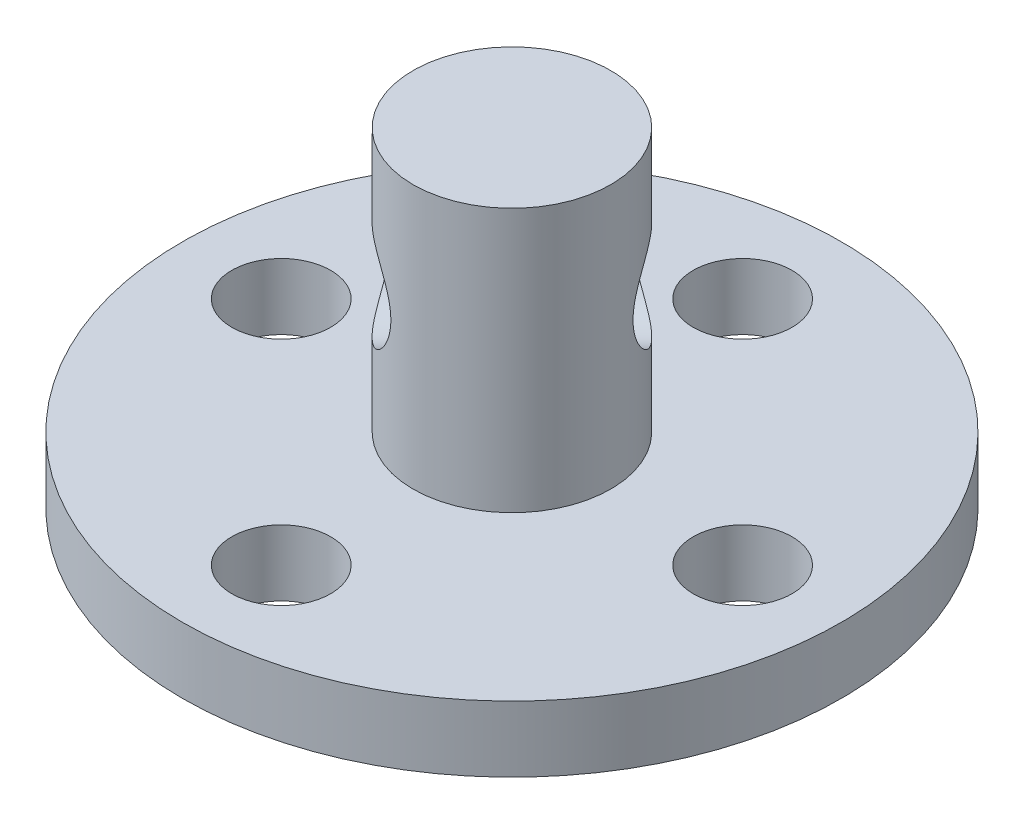
ISO-10303-21;
HEADER;
FILE_DESCRIPTION(('STEP AP214'),'2;1');
FILE_NAME('part.step','',(''),(''),'','','');
FILE_SCHEMA(('AUTOMOTIVE_DESIGN { 1 0 10303 214 1 1 1 1 }'));
ENDSEC;
DATA;
#1=APPLICATION_CONTEXT('core data for automotive mechanical design processes');
#2=APPLICATION_PROTOCOL_DEFINITION('international standard','automotive_design',2000,#1);
#3=PRODUCT_CONTEXT('',#1,'mechanical');
#4=PRODUCT('Part','Part','',(#3));
#5=PRODUCT_RELATED_PRODUCT_CATEGORY('part','',(#4));
#6=PRODUCT_DEFINITION_FORMATION('','',#4);
#7=PRODUCT_DEFINITION_CONTEXT('part definition',#1,'design');
#8=PRODUCT_DEFINITION('design','',#6,#7);
#9=PRODUCT_DEFINITION_SHAPE('','',#8);
#10=(LENGTH_UNIT() NAMED_UNIT(*) SI_UNIT(.MILLI.,.METRE.));
#11=(NAMED_UNIT(*) PLANE_ANGLE_UNIT() SI_UNIT($,.RADIAN.));
#12=(NAMED_UNIT(*) SI_UNIT($,.STERADIAN.) SOLID_ANGLE_UNIT());
#13=UNCERTAINTY_MEASURE_WITH_UNIT(LENGTH_MEASURE(1.E-05),#10,'distance_accuracy_value','');
#14=(GEOMETRIC_REPRESENTATION_CONTEXT(3) GLOBAL_UNCERTAINTY_ASSIGNED_CONTEXT((#13)) GLOBAL_UNIT_ASSIGNED_CONTEXT((#10,
#11,#12)) REPRESENTATION_CONTEXT('',''));
#15=CARTESIAN_POINT('',(0.,0.,0.));
#16=DIRECTION('',(0.,0.,1.));
#17=DIRECTION('',(1.,0.,0.));
#18=AXIS2_PLACEMENT_3D('',#15,#16,#17);
#19=CARTESIAN_POINT('',(0.,2.,0.));
#20=DIRECTION('',(0.,1.,0.));
#21=DIRECTION('',(0.,0.,1.));
#22=AXIS2_PLACEMENT_3D('',#19,#20,#21);
#23=PLANE('',#22);
#24=CARTESIAN_POINT('',(3.95332173747447E-13,2.,7.));
#25=DIRECTION('',(0.,1.,0.));
#26=DIRECTION('',(0.,0.,1.));
#27=AXIS2_PLACEMENT_3D('',#24,#25,#26);
#28=CIRCLE('',#27,1.50000000000042);
#29=CARTESIAN_POINT('',(3.95332173747447E-13,2.,8.50000000000043));
#30=VERTEX_POINT('',#29);
#31=EDGE_CURVE('E120',#30,#30,#28,.T.);
#32=ORIENTED_EDGE('',*,*,#31,.F.);
#33=EDGE_LOOP('',(#32));
#34=FACE_BOUND('',#33,.T.);
#35=CARTESIAN_POINT('',(0.,2.,-7.));
#36=DIRECTION('',(0.,1.,0.));
#37=DIRECTION('',(0.,0.,1.));
#38=AXIS2_PLACEMENT_3D('',#35,#36,#37);
#39=CIRCLE('',#38,1.5);
#40=CARTESIAN_POINT('',(0.,2.,-5.5));
#41=VERTEX_POINT('',#40);
#42=EDGE_CURVE('E132',#41,#41,#39,.T.);
#43=ORIENTED_EDGE('',*,*,#42,.F.);
#44=EDGE_LOOP('',(#43));
#45=FACE_BOUND('',#44,.T.);
#46=CARTESIAN_POINT('',(0.,2.,0.));
#47=DIRECTION('',(0.,1.,0.));
#48=DIRECTION('',(0.,0.,1.));
#49=AXIS2_PLACEMENT_3D('',#46,#47,#48);
#50=CIRCLE('',#49,10.);
#51=CARTESIAN_POINT('',(0.,2.,10.));
#52=VERTEX_POINT('',#51);
#53=EDGE_CURVE('E10',#52,#52,#50,.T.);
#54=ORIENTED_EDGE('',*,*,#53,.T.);
#55=EDGE_LOOP('',(#54));
#56=FACE_BOUND('',#55,.T.);
#57=CARTESIAN_POINT('',(0.,2.,0.));
#58=DIRECTION('',(0.,1.,0.));
#59=DIRECTION('',(0.,0.,1.));
#60=AXIS2_PLACEMENT_3D('',#57,#58,#59);
#61=CIRCLE('',#60,3.);
#62=CARTESIAN_POINT('',(0.,2.,3.));
#63=VERTEX_POINT('',#62);
#64=EDGE_CURVE('E53',#63,#63,#61,.T.);
#65=ORIENTED_EDGE('',*,*,#64,.F.);
#66=EDGE_LOOP('',(#65));
#67=FACE_BOUND('',#66,.T.);
#68=CARTESIAN_POINT('',(7.0000000000002,2.,-1.97666086873723E-13));
#69=DIRECTION('',(0.,1.,0.));
#70=DIRECTION('',(0.,0.,1.));
#71=AXIS2_PLACEMENT_3D('',#68,#69,#70);
#72=CIRCLE('',#71,1.50000000000015);
#73=CARTESIAN_POINT('',(7.0000000000002,2.,1.49999999999996));
#74=VERTEX_POINT('',#73);
#75=EDGE_CURVE('E126',#74,#74,#72,.T.);
#76=ORIENTED_EDGE('',*,*,#75,.F.);
#77=EDGE_LOOP('',(#76));
#78=FACE_BOUND('',#77,.T.);
#79=CARTESIAN_POINT('',(-6.9999999999998,2.,1.98523339633126E-13));
#80=DIRECTION('',(0.,1.,0.));
#81=DIRECTION('',(0.,0.,1.));
#82=AXIS2_PLACEMENT_3D('',#79,#80,#81);
#83=CIRCLE('',#82,1.50000000000032);
#84=CARTESIAN_POINT('',(-6.9999999999998,2.,1.50000000000052));
#85=VERTEX_POINT('',#84);
#86=EDGE_CURVE('E109',#85,#85,#83,.T.);
#87=ORIENTED_EDGE('',*,*,#86,.F.);
#88=EDGE_LOOP('',(#87));
#89=FACE_BOUND('',#88,.T.);
#90=ADVANCED_FACE('F35',(#34,#45,#56,#67,#78,#89),#23,.T.);
#91=CARTESIAN_POINT('',(0.,0.,0.));
#92=DIRECTION('',(0.,1.,0.));
#93=DIRECTION('',(0.,0.,1.));
#94=AXIS2_PLACEMENT_3D('',#91,#92,#93);
#95=PLANE('',#94);
#96=CARTESIAN_POINT('',(0.,0.,0.));
#97=DIRECTION('',(0.,1.,0.));
#98=DIRECTION('',(0.,0.,1.));
#99=AXIS2_PLACEMENT_3D('',#96,#97,#98);
#100=CIRCLE('',#99,10.);
#101=CARTESIAN_POINT('',(0.,0.,10.));
#102=VERTEX_POINT('',#101);
#103=EDGE_CURVE('E48',#102,#102,#100,.T.);
#104=ORIENTED_EDGE('',*,*,#103,.F.);
#105=EDGE_LOOP('',(#104));
#106=FACE_BOUND('',#105,.T.);
#107=CARTESIAN_POINT('',(0.,0.,-7.));
#108=DIRECTION('',(0.,1.,0.));
#109=DIRECTION('',(0.,0.,1.));
#110=AXIS2_PLACEMENT_3D('',#107,#108,#109);
#111=CIRCLE('',#110,1.5);
#112=CARTESIAN_POINT('',(0.,0.,-5.5));
#113=VERTEX_POINT('',#112);
#114=EDGE_CURVE('E129',#113,#113,#111,.T.);
#115=ORIENTED_EDGE('',*,*,#114,.T.);
#116=EDGE_LOOP('',(#115));
#117=FACE_BOUND('',#116,.T.);
#118=CARTESIAN_POINT('',(7.0000000000002,0.,-1.97666086873723E-13));
#119=DIRECTION('',(0.,1.,0.));
#120=DIRECTION('',(0.,0.,1.));
#121=AXIS2_PLACEMENT_3D('',#118,#119,#120);
#122=CIRCLE('',#121,1.50000000000015);
#123=CARTESIAN_POINT('',(7.0000000000002,0.,1.49999999999996));
#124=VERTEX_POINT('',#123);
#125=EDGE_CURVE('E123',#124,#124,#122,.T.);
#126=ORIENTED_EDGE('',*,*,#125,.T.);
#127=EDGE_LOOP('',(#126));
#128=FACE_BOUND('',#127,.T.);
#129=CARTESIAN_POINT('',(3.95332173747447E-13,0.,7.));
#130=DIRECTION('',(0.,1.,0.));
#131=DIRECTION('',(0.,0.,1.));
#132=AXIS2_PLACEMENT_3D('',#129,#130,#131);
#133=CIRCLE('',#132,1.50000000000042);
#134=CARTESIAN_POINT('',(3.95332173747447E-13,0.,8.50000000000043));
#135=VERTEX_POINT('',#134);
#136=EDGE_CURVE('E116',#135,#135,#133,.T.);
#137=ORIENTED_EDGE('',*,*,#136,.T.);
#138=EDGE_LOOP('',(#137));
#139=FACE_BOUND('',#138,.T.);
#140=CARTESIAN_POINT('',(-6.9999999999998,0.,1.98523339633126E-13));
#141=DIRECTION('',(0.,1.,0.));
#142=DIRECTION('',(0.,0.,1.));
#143=AXIS2_PLACEMENT_3D('',#140,#141,#142);
#144=CIRCLE('',#143,1.50000000000032);
#145=CARTESIAN_POINT('',(-6.9999999999998,0.,1.50000000000052));
#146=VERTEX_POINT('',#145);
#147=EDGE_CURVE('E112',#146,#146,#144,.T.);
#148=ORIENTED_EDGE('',*,*,#147,.T.);
#149=EDGE_LOOP('',(#148));
#150=FACE_BOUND('',#149,.T.);
#151=ADVANCED_FACE('F81',(#106,#117,#128,#139,#150),#95,.F.);
#152=CARTESIAN_POINT('',(0.,2.,0.));
#153=DIRECTION('',(0.,-1.,0.));
#154=DIRECTION('',(0.,0.,-1.));
#155=AXIS2_PLACEMENT_3D('',#152,#153,#154);
#156=CYLINDRICAL_SURFACE('',#155,10.);
#157=ORIENTED_EDGE('',*,*,#53,.F.);
#158=EDGE_LOOP('',(#157));
#159=FACE_BOUND('',#158,.T.);
#160=ORIENTED_EDGE('',*,*,#103,.T.);
#161=EDGE_LOOP('',(#160));
#162=FACE_BOUND('',#161,.T.);
#163=ADVANCED_FACE('F37',(#159,#162),#156,.T.);
#164=CARTESIAN_POINT('',(0.,2.,-7.));
#165=DIRECTION('',(0.,-1.,0.));
#166=DIRECTION('',(0.,0.,-1.));
#167=AXIS2_PLACEMENT_3D('',#164,#165,#166);
#168=CYLINDRICAL_SURFACE('',#167,1.5);
#169=ORIENTED_EDGE('',*,*,#42,.T.);
#170=EDGE_LOOP('',(#169));
#171=FACE_BOUND('',#170,.T.);
#172=ORIENTED_EDGE('',*,*,#114,.F.);
#173=EDGE_LOOP('',(#172));
#174=FACE_BOUND('',#173,.T.);
#175=ADVANCED_FACE('F91',(#171,#174),#168,.F.);
#176=CARTESIAN_POINT('',(7.0000000000002,2.,-1.97666086873723E-13));
#177=DIRECTION('',(0.,-1.,0.));
#178=DIRECTION('',(0.,0.,-1.));
#179=AXIS2_PLACEMENT_3D('',#176,#177,#178);
#180=CYLINDRICAL_SURFACE('',#179,1.50000000000015);
#181=ORIENTED_EDGE('',*,*,#75,.T.);
#182=EDGE_LOOP('',(#181));
#183=FACE_BOUND('',#182,.T.);
#184=ORIENTED_EDGE('',*,*,#125,.F.);
#185=EDGE_LOOP('',(#184));
#186=FACE_BOUND('',#185,.T.);
#187=ADVANCED_FACE('F94',(#183,#186),#180,.F.);
#188=CARTESIAN_POINT('',(3.95332173747447E-13,2.,7.));
#189=DIRECTION('',(0.,-1.,0.));
#190=DIRECTION('',(0.,0.,-1.));
#191=AXIS2_PLACEMENT_3D('',#188,#189,#190);
#192=CYLINDRICAL_SURFACE('',#191,1.50000000000042);
#193=ORIENTED_EDGE('',*,*,#31,.T.);
#194=EDGE_LOOP('',(#193));
#195=FACE_BOUND('',#194,.T.);
#196=ORIENTED_EDGE('',*,*,#136,.F.);
#197=EDGE_LOOP('',(#196));
#198=FACE_BOUND('',#197,.T.);
#199=ADVANCED_FACE('F98',(#195,#198),#192,.F.);
#200=CARTESIAN_POINT('',(-6.9999999999998,2.,1.98523339633126E-13));
#201=DIRECTION('',(0.,-1.,0.));
#202=DIRECTION('',(0.,0.,-1.));
#203=AXIS2_PLACEMENT_3D('',#200,#201,#202);
#204=CYLINDRICAL_SURFACE('',#203,1.50000000000032);
#205=ORIENTED_EDGE('',*,*,#86,.T.);
#206=EDGE_LOOP('',(#205));
#207=FACE_BOUND('',#206,.T.);
#208=ORIENTED_EDGE('',*,*,#147,.F.);
#209=EDGE_LOOP('',(#208));
#210=FACE_BOUND('',#209,.T.);
#211=ADVANCED_FACE('F77',(#207,#210),#204,.F.);
#212=CARTESIAN_POINT('',(0.,10.,0.));
#213=DIRECTION('',(0.,-1.,0.));
#214=DIRECTION('',(0.,0.,-1.));
#215=AXIS2_PLACEMENT_3D('',#212,#213,#214);
#216=CYLINDRICAL_SURFACE('',#215,3.);
#217=CARTESIAN_POINT('',(-2.8977774788672,6.,0.776457135307578));
#218=CARTESIAN_POINT('',(-2.89777843642086,6.07816171229288,0.77646580794522));
#219=CARTESIAN_POINT('',(-2.89596075365292,6.15642211728757,0.783337885586112));
#220=CARTESIAN_POINT('',(-2.88854556363684,6.31054089701573,0.810238787422568));
#221=CARTESIAN_POINT('',(-2.88294011324793,6.38639387256511,0.830295257550616));
#222=CARTESIAN_POINT('',(-2.86759385571555,6.53317749651591,0.881825990933521));
#223=CARTESIAN_POINT('',(-2.85787499736416,6.60413197871038,0.913239525995637));
#224=CARTESIAN_POINT('',(-2.83375960105533,6.74013630299508,0.985522074791584));
#225=CARTESIAN_POINT('',(-2.81936281002991,6.80518582539369,1.02639160004349));
#226=CARTESIAN_POINT('',(-2.78384605508351,6.93345859283626,1.11931695974481));
#227=CARTESIAN_POINT('',(-2.76226951340349,6.99608870351032,1.17201739854083));
#228=CARTESIAN_POINT('',(-2.7120800954357,7.11211258261006,1.28389309696415));
#229=CARTESIAN_POINT('',(-2.68346372649267,7.16550174387528,1.34307156240822));
#230=CARTESIAN_POINT('',(-2.61633504151044,7.26505072672149,1.46978353515752));
#231=CARTESIAN_POINT('',(-2.57728569203883,7.3104806517893,1.53761134146164));
#232=CARTESIAN_POINT('',(-2.49007432475969,7.38771127986864,1.6751542091128));
#233=CARTESIAN_POINT('',(-2.44191808567331,7.41952058420576,1.74486804977897));
#234=CARTESIAN_POINT('',(-2.34071742954987,7.46625699195165,1.87817425418939));
#235=CARTESIAN_POINT('',(-2.28826464060797,7.4822242895333,1.94184923030435));
#236=CARTESIAN_POINT('',(-2.17716035445959,7.50024917801256,2.06564121032914));
#237=CARTESIAN_POINT('',(-2.11851262971612,7.50231518519356,2.12576034519839));
#238=CARTESIAN_POINT('',(-2.0023114029252,7.49287998904448,2.23530137136983));
#239=CARTESIAN_POINT('',(-1.94510625043171,7.48254297671817,2.28519887174934));
#240=CARTESIAN_POINT('',(-1.82903282067119,7.45067873414301,2.37912040040673));
#241=CARTESIAN_POINT('',(-1.7701644192651,7.42915066653566,2.42314398886577));
#242=CARTESIAN_POINT('',(-1.65187898356766,7.37537615086528,2.50530608030928));
#243=CARTESIAN_POINT('',(-1.59246562724666,7.3429855302419,2.54335473361968));
#244=CARTESIAN_POINT('',(-1.47580220064364,7.26860487569776,2.61278069336991));
#245=CARTESIAN_POINT('',(-1.4185529134213,7.22661140504648,2.6441556035889));
#246=CARTESIAN_POINT('',(-1.30277736945862,7.12965697270048,2.70321718660423));
#247=CARTESIAN_POINT('',(-1.24464195101828,7.07384545751099,2.73027487166611));
#248=CARTESIAN_POINT('',(-1.13537205134785,6.95311541260474,2.77749540009897));
#249=CARTESIAN_POINT('',(-1.08424296543307,6.88818994158891,2.79765294762602));
#250=CARTESIAN_POINT('',(-0.988467637856764,6.74602771136387,2.83296699306694));
#251=CARTESIAN_POINT('',(-0.944439272066004,6.66827096541868,2.84772461492292));
#252=CARTESIAN_POINT('',(-0.870203141463087,6.5055934929615,2.87128516634126));
#253=CARTESIAN_POINT('',(-0.839980958308236,6.42068035047366,2.8800943127519));
#254=CARTESIAN_POINT('',(-0.797898740855268,6.25317823307581,2.89202420526221));
#255=CARTESIAN_POINT('',(-0.784773377993293,6.17093832143467,2.89554041189933));
#256=CARTESIAN_POINT('',(-0.773923684249208,6.00539798772519,2.89846195751578));
#257=CARTESIAN_POINT('',(-0.776188474338449,5.92209835632032,2.89787020033615));
#258=CARTESIAN_POINT('',(-0.79476043293402,5.76651912213191,2.89282271219333));
#259=CARTESIAN_POINT('',(-0.809504390277562,5.69403082333811,2.88879674637905));
#260=CARTESIAN_POINT('',(-0.849847525365734,5.55244832059356,2.87718549622092));
#261=CARTESIAN_POINT('',(-0.875450218468093,5.48335522388009,2.86959905914147));
#262=CARTESIAN_POINT('',(-0.937320913584755,5.34688300364596,2.85000428601381));
#263=CARTESIAN_POINT('',(-0.974027961374789,5.27973147471967,2.83780742241692));
#264=CARTESIAN_POINT('',(-1.05564763070852,5.15179609269151,2.80846718922544));
#265=CARTESIAN_POINT('',(-1.10056446582023,5.09101553473008,2.79132127696575));
#266=CARTESIAN_POINT('',(-1.2028340494715,4.96953184871468,2.74893115939282));
#267=CARTESIAN_POINT('',(-1.26104068458324,4.90980427392351,2.72293857041295));
#268=CARTESIAN_POINT('',(-1.38303494861756,4.80088164300961,2.66304918010131));
#269=CARTESIAN_POINT('',(-1.44682445252409,4.75169014465419,2.62914971686415));
#270=CARTESIAN_POINT('',(-1.57919386501896,4.66413941107485,2.55189425785637));
#271=CARTESIAN_POINT('',(-1.64785576996499,4.62610032268364,2.50831229866666));
#272=CARTESIAN_POINT('',(-1.78542113058999,4.56429314421391,2.41231873467999));
#273=CARTESIAN_POINT('',(-1.85432432047733,4.54051252295054,2.35991493507782));
#274=CARTESIAN_POINT('',(-1.98311144359731,4.50994715373801,2.25247602694358));
#275=CARTESIAN_POINT('',(-2.04324285223114,4.50180318618583,2.1981235133838));
#276=CARTESIAN_POINT('',(-2.15902393796181,4.4987351018184,2.08451046937595));
#277=CARTESIAN_POINT('',(-2.21467517691623,4.50380635721465,2.02525166408008));
#278=CARTESIAN_POINT('',(-2.31635207595352,4.52612461019344,1.90791731594305));
#279=CARTESIAN_POINT('',(-2.36277036625901,4.54254727388651,1.85002110919704));
#280=CARTESIAN_POINT('',(-2.44945348099616,4.58599049895446,1.73362251777722));
#281=CARTESIAN_POINT('',(-2.48971742182761,4.61301258014018,1.67512004734523));
#282=CARTESIAN_POINT('',(-2.56540042262159,4.67809057824896,1.55687507914991));
#283=CARTESIAN_POINT('',(-2.60053861020871,4.71656898481176,1.49718656380227));
#284=CARTESIAN_POINT('',(-2.66401345602036,4.80293689628858,1.3810927050713));
#285=CARTESIAN_POINT('',(-2.69234697700718,4.85083072367351,1.32468888511397));
#286=CARTESIAN_POINT('',(-2.74520076947934,4.96019570853405,1.21166858581719));
#287=CARTESIAN_POINT('',(-2.76906092274573,5.02254373121579,1.15558958126823));
#288=CARTESIAN_POINT('',(-2.8100006811322,5.15617608169466,1.05214039162088));
#289=CARTESIAN_POINT('',(-2.82707429614389,5.22746823130153,1.00477791984153));
#290=CARTESIAN_POINT('',(-2.85575022521722,5.37995496987143,0.920191613571842));
#291=CARTESIAN_POINT('',(-2.86716258468163,5.4613912966931,0.88333547926554));
#292=CARTESIAN_POINT('',(-2.8845080528995,5.62999860650967,0.824963295294638));
#293=CARTESIAN_POINT('',(-2.89045950183027,5.71714933336903,0.803395954954636));
#294=CARTESIAN_POINT('',(-2.89524136224008,5.83770803347799,0.785870399492784));
#295=CARTESIAN_POINT('',(-2.89619347565166,5.87005184159682,0.782348442320786));
#296=CARTESIAN_POINT('',(-2.89746135588973,5.93492472102336,0.777639926487422));
#297=CARTESIAN_POINT('',(-2.89777708014604,5.96745380457881,0.776453524059165));
#298=CARTESIAN_POINT('',(-2.8977774788672,6.,0.776457135307578));
#299=B_SPLINE_CURVE_WITH_KNOTS('',3,(#217,#218,#219,#220,#221,#222,#223,#224,#225,#226,#227,
#228,#229,#230,#231,#232,#233,#234,#235,#236,#237,#238,#239,#240,#241,#242,#243,#244,#245,#246,
#247,#248,#249,#250,#251,#252,#253,#254,#255,#256,#257,#258,#259,#260,#261,#262,#263,#264,#265,
#266,#267,#268,#269,#270,#271,#272,#273,#274,#275,#276,#277,#278,#279,#280,#281,#282,#283,#284,
#285,#286,#287,#288,#289,#290,#291,#292,#293,#294,#295,#296,#297,#298),.UNSPECIFIED.,.T.,.F.,(4,
2,2,2,2,2,2,2,2,2,2,2,2,2,2,2,2,2,2,2,2,2,2,2,2,2,2,2,2,2,2,2,2,2,2,2,2,2,2,2,4),(0.,
0.234348183892073,0.469189339237207,0.702792893878328,0.936409088167724,1.18929346874735,
1.44230356626556,1.71236838358145,1.98226240445837,2.23295227451903,2.4834903552906,
2.71224146226807,2.94100968776183,3.1729430209672,3.40495949025408,3.65890787185336,
3.91305072368878,4.18333262594172,4.45333161317557,4.70193436281318,4.95036139782559,
5.17161275136038,5.39293578654094,5.62450944609131,5.85620229330071,6.1171011537092,
6.37808797467303,6.64596272119449,6.91360169713157,7.1566840558423,7.39968130190957,
7.62666637307239,7.85368400268019,8.09041126079208,8.32724745151078,8.58765362775101,
8.84828914267731,9.11716123557907,9.3851269950414,9.48270202777964,9.5802835874181),.UNSPECIFIED.);
#300=CARTESIAN_POINT('',(-2.8977774788672,6.,0.776457135307578));
#301=VERTEX_POINT('',#300);
#302=EDGE_CURVE('E39',#301,#301,#299,.T.);
#303=ORIENTED_EDGE('',*,*,#302,.T.);
#304=EDGE_LOOP('',(#303));
#305=FACE_BOUND('',#304,.T.);
#306=CARTESIAN_POINT('',(0.776457135307547,6.,-2.89777747886721));
#307=CARTESIAN_POINT('',(0.776465807945189,5.92183828770712,-2.89777843642087));
#308=CARTESIAN_POINT('',(0.783337885586081,5.84357788271243,-2.89596075365293));
#309=CARTESIAN_POINT('',(0.810238787422538,5.68945910298427,-2.88854556363685));
#310=CARTESIAN_POINT('',(0.830295257550587,5.61360612743489,-2.88294011324794));
#311=CARTESIAN_POINT('',(0.881825990933491,5.46682250348409,-2.86759385571556));
#312=CARTESIAN_POINT('',(0.913239525995606,5.39586802128962,-2.85787499736417));
#313=CARTESIAN_POINT('',(0.985522074791554,5.25986369700492,-2.83375960105534));
#314=CARTESIAN_POINT('',(1.02639160004346,5.19481417460631,-2.81936281002992));
#315=CARTESIAN_POINT('',(1.11931695974478,5.06654140716374,-2.78384605508352));
#316=CARTESIAN_POINT('',(1.1720173985408,5.00391129648969,-2.76226951340351));
#317=CARTESIAN_POINT('',(1.28389309696413,4.88788741738994,-2.71208009543571));
#318=CARTESIAN_POINT('',(1.34307156240819,4.83449825612472,-2.68346372649268));
#319=CARTESIAN_POINT('',(1.46978353515749,4.73494927327851,-2.61633504151046));
#320=CARTESIAN_POINT('',(1.53761134146162,4.6895193482107,-2.57728569203884));
#321=CARTESIAN_POINT('',(1.67515420911277,4.61228872013136,-2.49007432475971));
#322=CARTESIAN_POINT('',(1.74486804977894,4.58047941579424,-2.44191808567333));
#323=CARTESIAN_POINT('',(1.87817425418937,4.53374300804835,-2.34071742954989));
#324=CARTESIAN_POINT('',(1.94184923030433,4.5177757104667,-2.28826464060799));
#325=CARTESIAN_POINT('',(2.06564121032912,4.49975082198744,-2.17716035445961));
#326=CARTESIAN_POINT('',(2.12576034519836,4.49768481480644,-2.11851262971614));
#327=CARTESIAN_POINT('',(2.23530137136981,4.50712001095553,-2.00231140292522));
#328=CARTESIAN_POINT('',(2.28519887174932,4.51745702328184,-1.94510625043173));
#329=CARTESIAN_POINT('',(2.37912040040671,4.54932126585699,-1.82903282067121));
#330=CARTESIAN_POINT('',(2.42314398886575,4.57084933346434,-1.77016441926513));
#331=CARTESIAN_POINT('',(2.50530608030926,4.62462384913472,-1.65187898356769));
#332=CARTESIAN_POINT('',(2.54335473361967,4.6570144697581,-1.59246562724668));
#333=CARTESIAN_POINT('',(2.6127806933699,4.73139512430224,-1.47580220064367));
#334=CARTESIAN_POINT('',(2.64415560358889,4.77338859495353,-1.41855291342133));
#335=CARTESIAN_POINT('',(2.70321718660421,4.87034302729952,-1.30277736945865));
#336=CARTESIAN_POINT('',(2.7302748716661,4.92615454248902,-1.24464195101831));
#337=CARTESIAN_POINT('',(2.77749540009896,5.04688458739527,-1.13537205134787));
#338=CARTESIAN_POINT('',(2.79765294762601,5.11181005841109,-1.0842429654331));
#339=CARTESIAN_POINT('',(2.83296699306693,5.25397228863613,-0.988467637856793));
#340=CARTESIAN_POINT('',(2.84772461492291,5.33172903458132,-0.944439272066034));
#341=CARTESIAN_POINT('',(2.87128516634125,5.4944065070385,-0.870203141463117));
#342=CARTESIAN_POINT('',(2.88009431275189,5.57931964952634,-0.839980958308266));
#343=CARTESIAN_POINT('',(2.8920242052622,5.74682176692419,-0.797898740855298));
#344=CARTESIAN_POINT('',(2.89554041189933,5.82906167856533,-0.784773377993323));
#345=CARTESIAN_POINT('',(2.89846195751577,5.99460201227481,-0.773923684249239));
#346=CARTESIAN_POINT('',(2.89787020033614,6.07790164367968,-0.776188474338479));
#347=CARTESIAN_POINT('',(2.89282271219332,6.23348087786809,-0.79476043293405));
#348=CARTESIAN_POINT('',(2.88879674637904,6.30596917666189,-0.809504390277593));
#349=CARTESIAN_POINT('',(2.87718549622091,6.44755167940644,-0.849847525365765));
#350=CARTESIAN_POINT('',(2.86959905914146,6.51664477611991,-0.875450218468124));
#351=CARTESIAN_POINT('',(2.8500042860138,6.65311699635405,-0.937320913584786));
#352=CARTESIAN_POINT('',(2.83780742241691,6.72026852528033,-0.97402796137482));
#353=CARTESIAN_POINT('',(2.80846718922543,6.84820390730849,-1.05564763070855));
#354=CARTESIAN_POINT('',(2.79132127696574,6.90898446526993,-1.10056446582026));
#355=CARTESIAN_POINT('',(2.74893115939281,7.03046815128532,-1.20283404947153));
#356=CARTESIAN_POINT('',(2.72293857041293,7.09019572607649,-1.26104068458327));
#357=CARTESIAN_POINT('',(2.6630491801013,7.19911835699039,-1.38303494861759));
#358=CARTESIAN_POINT('',(2.62914971686414,7.24830985534581,-1.44682445252412));
#359=CARTESIAN_POINT('',(2.55189425785635,7.33586058892515,-1.57919386501899));
#360=CARTESIAN_POINT('',(2.50831229866664,7.37389967731637,-1.64785576996502));
#361=CARTESIAN_POINT('',(2.41231873467997,7.43570685578609,-1.78542113059002));
#362=CARTESIAN_POINT('',(2.3599149350778,7.45948747704946,-1.85432432047736));
#363=CARTESIAN_POINT('',(2.25247602694356,7.49005284626199,-1.98311144359733));
#364=CARTESIAN_POINT('',(2.19812351338378,7.49819681381417,-2.04324285223117));
#365=CARTESIAN_POINT('',(2.08451046937593,7.5012648981816,-2.15902393796183));
#366=CARTESIAN_POINT('',(2.02525166408006,7.49619364278535,-2.21467517691625));
#367=CARTESIAN_POINT('',(1.90791731594303,7.47387538980656,-2.31635207595354));
#368=CARTESIAN_POINT('',(1.85002110919701,7.45745272611349,-2.36277036625903));
#369=CARTESIAN_POINT('',(1.7336225177772,7.41400950104554,-2.44945348099618));
#370=CARTESIAN_POINT('',(1.67512004734521,7.38698741985982,-2.48971742182763));
#371=CARTESIAN_POINT('',(1.55687507914988,7.32190942175104,-2.5654004226216));
#372=CARTESIAN_POINT('',(1.49718656380224,7.28343101518824,-2.60053861020873));
#373=CARTESIAN_POINT('',(1.38109270507127,7.19706310371142,-2.66401345602038));
#374=CARTESIAN_POINT('',(1.32468888511394,7.14916927632649,-2.6923469770072));
#375=CARTESIAN_POINT('',(1.21166858581716,7.03980429146594,-2.74520076947936));
#376=CARTESIAN_POINT('',(1.1555895812682,6.97745626878421,-2.76906092274574));
#377=CARTESIAN_POINT('',(1.05214039162085,6.84382391830534,-2.81000068113221));
#378=CARTESIAN_POINT('',(1.0047779198415,6.77253176869847,-2.8270742961439));
#379=CARTESIAN_POINT('',(0.920191613571812,6.62004503012857,-2.85575022521723));
#380=CARTESIAN_POINT('',(0.88333547926551,6.53860870330689,-2.86716258468164));
#381=CARTESIAN_POINT('',(0.824963295294608,6.37000139349033,-2.88450805289951));
#382=CARTESIAN_POINT('',(0.803395954954605,6.28285066663097,-2.89045950183028));
#383=CARTESIAN_POINT('',(0.785870399492753,6.16229196652201,-2.89524136224009));
#384=CARTESIAN_POINT('',(0.782348442320756,6.12994815840317,-2.89619347565167));
#385=CARTESIAN_POINT('',(0.777639926487392,6.06507527897663,-2.89746135588974));
#386=CARTESIAN_POINT('',(0.776453524059134,6.03254619542119,-2.89777708014605));
#387=CARTESIAN_POINT('',(0.776457135307547,6.,-2.89777747886721));
#388=B_SPLINE_CURVE_WITH_KNOTS('',3,(#306,#307,#308,#309,#310,#311,#312,#313,#314,#315,#316,
#317,#318,#319,#320,#321,#322,#323,#324,#325,#326,#327,#328,#329,#330,#331,#332,#333,#334,#335,
#336,#337,#338,#339,#340,#341,#342,#343,#344,#345,#346,#347,#348,#349,#350,#351,#352,#353,#354,
#355,#356,#357,#358,#359,#360,#361,#362,#363,#364,#365,#366,#367,#368,#369,#370,#371,#372,#373,
#374,#375,#376,#377,#378,#379,#380,#381,#382,#383,#384,#385,#386,#387),.UNSPECIFIED.,.T.,.F.,(4,
2,2,2,2,2,2,2,2,2,2,2,2,2,2,2,2,2,2,2,2,2,2,2,2,2,2,2,2,2,2,2,2,2,2,2,2,2,2,2,4),(0.,
0.234348183892073,0.469189339237207,0.702792893878329,0.936409088167724,1.18929346874735,
1.44230356626556,1.71236838358145,1.98226240445837,2.23295227451903,2.4834903552906,
2.71224146226808,2.94100968776183,3.1729430209672,3.40495949025408,3.65890787185336,
3.91305072368878,4.18333262594173,4.45333161317557,4.70193436281318,4.95036139782559,
5.17161275136038,5.39293578654095,5.62450944609132,5.85620229330071,6.1171011537092,
6.37808797467303,6.64596272119449,6.91360169713157,7.1566840558423,7.39968130190957,
7.62666637307239,7.85368400268019,8.09041126079208,8.32724745151079,8.58765362775101,
8.84828914267731,9.11716123557907,9.3851269950414,9.48270202777964,9.58028358741811),.UNSPECIFIED.);
#389=CARTESIAN_POINT('',(0.776457135307547,6.,-2.89777747886721));
#390=VERTEX_POINT('',#389);
#391=EDGE_CURVE('E57',#390,#390,#388,.T.);
#392=ORIENTED_EDGE('',*,*,#391,.T.);
#393=EDGE_LOOP('',(#392));
#394=FACE_BOUND('',#393,.T.);
#395=ORIENTED_EDGE('',*,*,#64,.T.);
#396=EDGE_LOOP('',(#395));
#397=FACE_BOUND('',#396,.T.);
#398=CARTESIAN_POINT('',(0.,10.,0.));
#399=DIRECTION('',(0.,1.,0.));
#400=DIRECTION('',(0.,0.,1.));
#401=AXIS2_PLACEMENT_3D('',#398,#399,#400);
#402=CIRCLE('',#401,3.);
#403=CARTESIAN_POINT('',(0.,10.,3.));
#404=VERTEX_POINT('',#403);
#405=EDGE_CURVE('E114',#404,#404,#402,.T.);
#406=ORIENTED_EDGE('',*,*,#405,.F.);
#407=EDGE_LOOP('',(#406));
#408=FACE_BOUND('',#407,.T.);
#409=ADVANCED_FACE('F62',(#305,#394,#397,#408),#216,.T.);
#410=CARTESIAN_POINT('',(0.,10.,0.));
#411=DIRECTION('',(0.,1.,0.));
#412=DIRECTION('',(0.,0.,1.));
#413=AXIS2_PLACEMENT_3D('',#410,#411,#412);
#414=PLANE('',#413);
#415=ORIENTED_EDGE('',*,*,#405,.T.);
#416=EDGE_LOOP('',(#415));
#417=FACE_BOUND('',#416,.T.);
#418=ADVANCED_FACE('F69',(#417),#414,.T.);
#419=CARTESIAN_POINT('',(-3.53553390593272,6.,3.53553390593276));
#420=DIRECTION('',(0.707106781186544,0.,-0.707106781186551));
#421=DIRECTION('',(-0.707106781186551,0.,-0.707106781186544));
#422=AXIS2_PLACEMENT_3D('',#419,#420,#421);
#423=CYLINDRICAL_SURFACE('',#422,1.5);
#424=ORIENTED_EDGE('',*,*,#391,.F.);
#425=EDGE_LOOP('',(#424));
#426=FACE_BOUND('',#425,.T.);
#427=ORIENTED_EDGE('',*,*,#302,.F.);
#428=EDGE_LOOP('',(#427));
#429=FACE_BOUND('',#428,.T.);
#430=ADVANCED_FACE('F66',(#426,#429),#423,.F.);
#431=CLOSED_SHELL('',(#90,#151,#163,#175,#187,#199,#211,#409,#418,#430));
#432=MANIFOLD_SOLID_BREP('B2',#431);
#433=ADVANCED_BREP_SHAPE_REPRESENTATION('',(#18,#432),#14);
#434=SHAPE_DEFINITION_REPRESENTATION(#9,#433);
ENDSEC;
END-ISO-10303-21;
